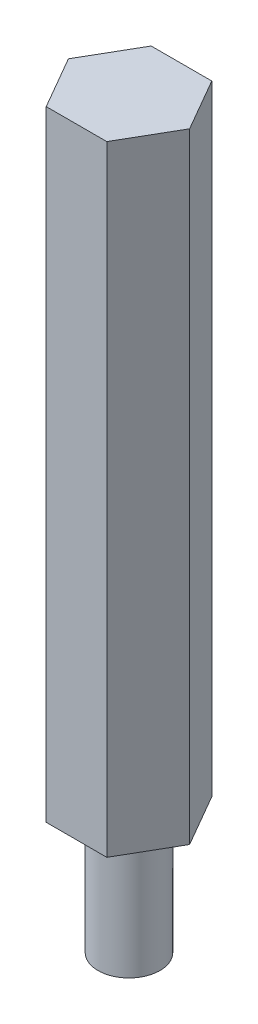
ISO-10303-21;
HEADER;
FILE_DESCRIPTION(('STEP AP214'),'2;1');
FILE_NAME('part.step','',(''),(''),'','','');
FILE_SCHEMA(('AUTOMOTIVE_DESIGN { 1 0 10303 214 1 1 1 1 }'));
ENDSEC;
DATA;
#1=APPLICATION_CONTEXT('core data for automotive mechanical design processes');
#2=APPLICATION_PROTOCOL_DEFINITION('international standard','automotive_design',2000,#1);
#3=PRODUCT_CONTEXT('',#1,'mechanical');
#4=PRODUCT('Part','Part','',(#3));
#5=PRODUCT_RELATED_PRODUCT_CATEGORY('part','',(#4));
#6=PRODUCT_DEFINITION_FORMATION('','',#4);
#7=PRODUCT_DEFINITION_CONTEXT('part definition',#1,'design');
#8=PRODUCT_DEFINITION('design','',#6,#7);
#9=PRODUCT_DEFINITION_SHAPE('','',#8);
#10=(LENGTH_UNIT() NAMED_UNIT(*) SI_UNIT(.MILLI.,.METRE.));
#11=(NAMED_UNIT(*) PLANE_ANGLE_UNIT() SI_UNIT($,.RADIAN.));
#12=(NAMED_UNIT(*) SI_UNIT($,.STERADIAN.) SOLID_ANGLE_UNIT());
#13=UNCERTAINTY_MEASURE_WITH_UNIT(LENGTH_MEASURE(1.E-05),#10,'distance_accuracy_value','');
#14=(GEOMETRIC_REPRESENTATION_CONTEXT(3) GLOBAL_UNCERTAINTY_ASSIGNED_CONTEXT((#13)) GLOBAL_UNIT_ASSIGNED_CONTEXT((#10,
#11,#12)) REPRESENTATION_CONTEXT('',''));
#15=CARTESIAN_POINT('',(0.,0.,0.));
#16=DIRECTION('',(0.,0.,1.));
#17=DIRECTION('',(1.,0.,0.));
#18=AXIS2_PLACEMENT_3D('',#15,#16,#17);
#19=CARTESIAN_POINT('',(2.93293936748329,30.,0.));
#20=DIRECTION('',(-0.866025403784439,0.,0.499999999999999));
#21=DIRECTION('',(0.499999999999999,0.,0.866025403784439));
#22=AXIS2_PLACEMENT_3D('',#19,#20,#21);
#23=PLANE('',#22);
#24=DIRECTION('',(-0.499999999999999,0.,-0.866025403784439));
#25=VECTOR('',#24,1.);
#26=CARTESIAN_POINT('',(2.93293936748329,0.,0.));
#27=LINE('',#26,#25);
#28=CARTESIAN_POINT('',(2.93293936748329,0.,0.));
#29=VERTEX_POINT('',#28);
#30=CARTESIAN_POINT('',(1.46646968374166,0.,-2.53999999999997));
#31=VERTEX_POINT('',#30);
#32=EDGE_CURVE('E136',#29,#31,#27,.T.);
#33=ORIENTED_EDGE('',*,*,#32,.T.);
#34=DIRECTION('',(0.,-1.,0.));
#35=VECTOR('',#34,1.);
#36=CARTESIAN_POINT('',(1.46646968374166,30.,-2.53999999999997));
#37=LINE('',#36,#35);
#38=CARTESIAN_POINT('',(1.46646968374166,30.,-2.53999999999997));
#39=VERTEX_POINT('',#38);
#40=EDGE_CURVE('E48',#39,#31,#37,.T.);
#41=ORIENTED_EDGE('',*,*,#40,.F.);
#42=DIRECTION('',(-0.499999999999999,0.,-0.866025403784439));
#43=VECTOR('',#42,1.);
#44=CARTESIAN_POINT('',(2.93293936748329,30.,0.));
#45=LINE('',#44,#43);
#46=CARTESIAN_POINT('',(2.93293936748329,30.,0.));
#47=VERTEX_POINT('',#46);
#48=EDGE_CURVE('E153',#47,#39,#45,.T.);
#49=ORIENTED_EDGE('',*,*,#48,.F.);
#50=DIRECTION('',(0.,-1.,0.));
#51=VECTOR('',#50,1.);
#52=CARTESIAN_POINT('',(2.93293936748329,30.,0.));
#53=LINE('',#52,#51);
#54=EDGE_CURVE('E132',#47,#29,#53,.T.);
#55=ORIENTED_EDGE('',*,*,#54,.T.);
#56=EDGE_LOOP('',(#33,#41,#49,#55));
#57=FACE_BOUND('',#56,.T.);
#58=ADVANCED_FACE('F45',(#57),#23,.F.);
#59=CARTESIAN_POINT('',(1.46646968374166,30.,-2.53999999999997));
#60=DIRECTION('',(0.,0.,1.));
#61=DIRECTION('',(1.,0.,0.));
#62=AXIS2_PLACEMENT_3D('',#59,#60,#61);
#63=PLANE('',#62);
#64=DIRECTION('',(-1.,0.,0.));
#65=VECTOR('',#64,1.);
#66=CARTESIAN_POINT('',(1.46646968374166,0.,-2.53999999999997));
#67=LINE('',#66,#65);
#68=CARTESIAN_POINT('',(-1.46646968374167,0.,-2.53999999999999));
#69=VERTEX_POINT('',#68);
#70=EDGE_CURVE('E140',#31,#69,#67,.T.);
#71=ORIENTED_EDGE('',*,*,#70,.T.);
#72=DIRECTION('',(0.,-1.,0.));
#73=VECTOR('',#72,1.);
#74=CARTESIAN_POINT('',(-1.46646968374167,30.,-2.53999999999999));
#75=LINE('',#74,#73);
#76=CARTESIAN_POINT('',(-1.46646968374167,30.,-2.53999999999999));
#77=VERTEX_POINT('',#76);
#78=EDGE_CURVE('E159',#77,#69,#75,.T.);
#79=ORIENTED_EDGE('',*,*,#78,.F.);
#80=DIRECTION('',(-1.,0.,0.));
#81=VECTOR('',#80,1.);
#82=CARTESIAN_POINT('',(1.46646968374166,30.,-2.53999999999997));
#83=LINE('',#82,#81);
#84=EDGE_CURVE('E101',#39,#77,#83,.T.);
#85=ORIENTED_EDGE('',*,*,#84,.F.);
#86=ORIENTED_EDGE('',*,*,#40,.T.);
#87=EDGE_LOOP('',(#71,#79,#85,#86));
#88=FACE_BOUND('',#87,.T.);
#89=ADVANCED_FACE('F166',(#88),#63,.F.);
#90=CARTESIAN_POINT('',(-1.46646968374167,30.,-2.53999999999999));
#91=DIRECTION('',(0.86602540378444,0.,0.499999999999998));
#92=DIRECTION('',(0.499999999999998,0.,-0.86602540378444));
#93=AXIS2_PLACEMENT_3D('',#90,#91,#92);
#94=PLANE('',#93);
#95=DIRECTION('',(-0.499999999999998,0.,0.86602540378444));
#96=VECTOR('',#95,1.);
#97=CARTESIAN_POINT('',(-1.46646968374167,0.,-2.53999999999999));
#98=LINE('',#97,#96);
#99=CARTESIAN_POINT('',(-2.9329393674833,0.,0.));
#100=VERTEX_POINT('',#99);
#101=EDGE_CURVE('E144',#69,#100,#98,.T.);
#102=ORIENTED_EDGE('',*,*,#101,.T.);
#103=DIRECTION('',(0.,-1.,0.));
#104=VECTOR('',#103,1.);
#105=CARTESIAN_POINT('',(-2.9329393674833,30.,0.));
#106=LINE('',#105,#104);
#107=CARTESIAN_POINT('',(-2.9329393674833,30.,0.));
#108=VERTEX_POINT('',#107);
#109=EDGE_CURVE('E125',#108,#100,#106,.T.);
#110=ORIENTED_EDGE('',*,*,#109,.F.);
#111=DIRECTION('',(-0.499999999999998,0.,0.86602540378444));
#112=VECTOR('',#111,1.);
#113=CARTESIAN_POINT('',(-1.46646968374167,30.,-2.53999999999999));
#114=LINE('',#113,#112);
#115=EDGE_CURVE('E114',#77,#108,#114,.T.);
#116=ORIENTED_EDGE('',*,*,#115,.F.);
#117=ORIENTED_EDGE('',*,*,#78,.T.);
#118=EDGE_LOOP('',(#102,#110,#116,#117));
#119=FACE_BOUND('',#118,.T.);
#120=ADVANCED_FACE('F172',(#119),#94,.F.);
#121=CARTESIAN_POINT('',(-2.9329393674833,30.,0.));
#122=DIRECTION('',(0.866025403784439,0.,-0.5));
#123=DIRECTION('',(-0.5,0.,-0.866025403784439));
#124=AXIS2_PLACEMENT_3D('',#121,#122,#123);
#125=PLANE('',#124);
#126=DIRECTION('',(0.5,0.,0.866025403784439));
#127=VECTOR('',#126,1.);
#128=CARTESIAN_POINT('',(-2.9329393674833,0.,0.));
#129=LINE('',#128,#127);
#130=CARTESIAN_POINT('',(-1.46646968374166,0.,2.53999999999999));
#131=VERTEX_POINT('',#130);
#132=EDGE_CURVE('E123',#100,#131,#129,.T.);
#133=ORIENTED_EDGE('',*,*,#132,.T.);
#134=DIRECTION('',(0.,-1.,0.));
#135=VECTOR('',#134,1.);
#136=CARTESIAN_POINT('',(-1.46646968374166,30.,2.53999999999999));
#137=LINE('',#136,#135);
#138=CARTESIAN_POINT('',(-1.46646968374166,30.,2.53999999999999));
#139=VERTEX_POINT('',#138);
#140=EDGE_CURVE('E120',#139,#131,#137,.T.);
#141=ORIENTED_EDGE('',*,*,#140,.F.);
#142=DIRECTION('',(0.5,0.,0.866025403784439));
#143=VECTOR('',#142,1.);
#144=CARTESIAN_POINT('',(-2.9329393674833,30.,0.));
#145=LINE('',#144,#143);
#146=EDGE_CURVE('E108',#108,#139,#145,.T.);
#147=ORIENTED_EDGE('',*,*,#146,.F.);
#148=ORIENTED_EDGE('',*,*,#109,.T.);
#149=EDGE_LOOP('',(#133,#141,#147,#148));
#150=FACE_BOUND('',#149,.T.);
#151=ADVANCED_FACE('F121',(#150),#125,.F.);
#152=CARTESIAN_POINT('',(-1.46646968374166,30.,2.53999999999999));
#153=DIRECTION('',(0.,0.,-1.));
#154=DIRECTION('',(-1.,0.,0.));
#155=AXIS2_PLACEMENT_3D('',#152,#153,#154);
#156=PLANE('',#155);
#157=DIRECTION('',(1.,0.,0.));
#158=VECTOR('',#157,1.);
#159=CARTESIAN_POINT('',(-1.46646968374166,0.,2.53999999999999));
#160=LINE('',#159,#158);
#161=CARTESIAN_POINT('',(1.46646968374164,0.,2.53999999999999));
#162=VERTEX_POINT('',#161);
#163=EDGE_CURVE('E86',#131,#162,#160,.T.);
#164=ORIENTED_EDGE('',*,*,#163,.T.);
#165=DIRECTION('',(0.,-1.,0.));
#166=VECTOR('',#165,1.);
#167=CARTESIAN_POINT('',(1.46646968374164,30.,2.53999999999999));
#168=LINE('',#167,#166);
#169=CARTESIAN_POINT('',(1.46646968374164,30.,2.53999999999999));
#170=VERTEX_POINT('',#169);
#171=EDGE_CURVE('E126',#170,#162,#168,.T.);
#172=ORIENTED_EDGE('',*,*,#171,.F.);
#173=DIRECTION('',(1.,0.,0.));
#174=VECTOR('',#173,1.);
#175=CARTESIAN_POINT('',(-1.46646968374166,30.,2.53999999999999));
#176=LINE('',#175,#174);
#177=EDGE_CURVE('E112',#139,#170,#176,.T.);
#178=ORIENTED_EDGE('',*,*,#177,.F.);
#179=ORIENTED_EDGE('',*,*,#140,.T.);
#180=EDGE_LOOP('',(#164,#172,#178,#179));
#181=FACE_BOUND('',#180,.T.);
#182=ADVANCED_FACE('F128',(#181),#156,.F.);
#183=CARTESIAN_POINT('',(1.46646968374164,30.,2.53999999999999));
#184=DIRECTION('',(-0.866025403784438,0.,-0.500000000000001));
#185=DIRECTION('',(-0.500000000000001,0.,0.866025403784438));
#186=AXIS2_PLACEMENT_3D('',#183,#184,#185);
#187=PLANE('',#186);
#188=DIRECTION('',(0.500000000000001,0.,-0.866025403784438));
#189=VECTOR('',#188,1.);
#190=CARTESIAN_POINT('',(1.46646968374164,0.,2.53999999999999));
#191=LINE('',#190,#189);
#192=EDGE_CURVE('E92',#162,#29,#191,.T.);
#193=ORIENTED_EDGE('',*,*,#192,.T.);
#194=ORIENTED_EDGE('',*,*,#54,.F.);
#195=DIRECTION('',(0.500000000000001,0.,-0.866025403784438));
#196=VECTOR('',#195,1.);
#197=CARTESIAN_POINT('',(1.46646968374164,30.,2.53999999999999));
#198=LINE('',#197,#196);
#199=EDGE_CURVE('E63',#170,#47,#198,.T.);
#200=ORIENTED_EDGE('',*,*,#199,.F.);
#201=ORIENTED_EDGE('',*,*,#171,.T.);
#202=EDGE_LOOP('',(#193,#194,#200,#201));
#203=FACE_BOUND('',#202,.T.);
#204=ADVANCED_FACE('F196',(#203),#187,.F.);
#205=CARTESIAN_POINT('',(0.,30.,0.));
#206=DIRECTION('',(0.,1.,0.));
#207=DIRECTION('',(0.,0.,1.));
#208=AXIS2_PLACEMENT_3D('',#205,#206,#207);
#209=PLANE('',#208);
#210=ORIENTED_EDGE('',*,*,#48,.T.);
#211=ORIENTED_EDGE('',*,*,#84,.T.);
#212=ORIENTED_EDGE('',*,*,#115,.T.);
#213=ORIENTED_EDGE('',*,*,#146,.T.);
#214=ORIENTED_EDGE('',*,*,#177,.T.);
#215=ORIENTED_EDGE('',*,*,#199,.T.);
#216=EDGE_LOOP('',(#210,#211,#212,#213,#214,#215));
#217=FACE_BOUND('',#216,.T.);
#218=ADVANCED_FACE('F110',(#217),#209,.T.);
#219=CARTESIAN_POINT('',(0.,0.,0.));
#220=DIRECTION('',(0.,1.,0.));
#221=DIRECTION('',(0.,0.,1.));
#222=AXIS2_PLACEMENT_3D('',#219,#220,#221);
#223=PLANE('',#222);
#224=CARTESIAN_POINT('',(0.,0.,0.));
#225=DIRECTION('',(0.,-1.,0.));
#226=DIRECTION('',(0.,0.,-1.));
#227=AXIS2_PLACEMENT_3D('',#224,#225,#226);
#228=CIRCLE('',#227,1.5);
#229=CARTESIAN_POINT('',(0.,0.,-1.5));
#230=VERTEX_POINT('',#229);
#231=EDGE_CURVE('E11',#230,#230,#228,.T.);
#232=ORIENTED_EDGE('',*,*,#231,.F.);
#233=EDGE_LOOP('',(#232));
#234=FACE_BOUND('',#233,.T.);
#235=ORIENTED_EDGE('',*,*,#32,.F.);
#236=ORIENTED_EDGE('',*,*,#192,.F.);
#237=ORIENTED_EDGE('',*,*,#163,.F.);
#238=ORIENTED_EDGE('',*,*,#132,.F.);
#239=ORIENTED_EDGE('',*,*,#101,.F.);
#240=ORIENTED_EDGE('',*,*,#70,.F.);
#241=EDGE_LOOP('',(#235,#236,#237,#238,#239,#240));
#242=FACE_BOUND('',#241,.T.);
#243=ADVANCED_FACE('F171',(#234,#242),#223,.F.);
#244=CARTESIAN_POINT('',(0.,-6.,0.));
#245=DIRECTION('',(0.,1.,0.));
#246=DIRECTION('',(0.,0.,1.));
#247=AXIS2_PLACEMENT_3D('',#244,#245,#246);
#248=CYLINDRICAL_SURFACE('',#247,1.5);
#249=CARTESIAN_POINT('',(0.,-6.,0.));
#250=DIRECTION('',(0.,-1.,0.));
#251=DIRECTION('',(0.,0.,-1.));
#252=AXIS2_PLACEMENT_3D('',#249,#250,#251);
#253=CIRCLE('',#252,1.5);
#254=CARTESIAN_POINT('',(0.,-6.,-1.5));
#255=VERTEX_POINT('',#254);
#256=EDGE_CURVE('E141',#255,#255,#253,.T.);
#257=ORIENTED_EDGE('',*,*,#256,.F.);
#258=EDGE_LOOP('',(#257));
#259=FACE_BOUND('',#258,.T.);
#260=ORIENTED_EDGE('',*,*,#231,.T.);
#261=EDGE_LOOP('',(#260));
#262=FACE_BOUND('',#261,.T.);
#263=ADVANCED_FACE('F185',(#259,#262),#248,.T.);
#264=CARTESIAN_POINT('',(0.,-6.,0.));
#265=DIRECTION('',(0.,-1.,0.));
#266=DIRECTION('',(0.,0.,-1.));
#267=AXIS2_PLACEMENT_3D('',#264,#265,#266);
#268=PLANE('',#267);
#269=ORIENTED_EDGE('',*,*,#256,.T.);
#270=EDGE_LOOP('',(#269));
#271=FACE_BOUND('',#270,.T.);
#272=ADVANCED_FACE('F183',(#271),#268,.T.);
#273=CLOSED_SHELL('',(#58,#89,#120,#151,#182,#204,#218,#243,#263,#272));
#274=MANIFOLD_SOLID_BREP('B2',#273);
#275=ADVANCED_BREP_SHAPE_REPRESENTATION('',(#18,#274),#14);
#276=SHAPE_DEFINITION_REPRESENTATION(#9,#275);
ENDSEC;
END-ISO-10303-21;
